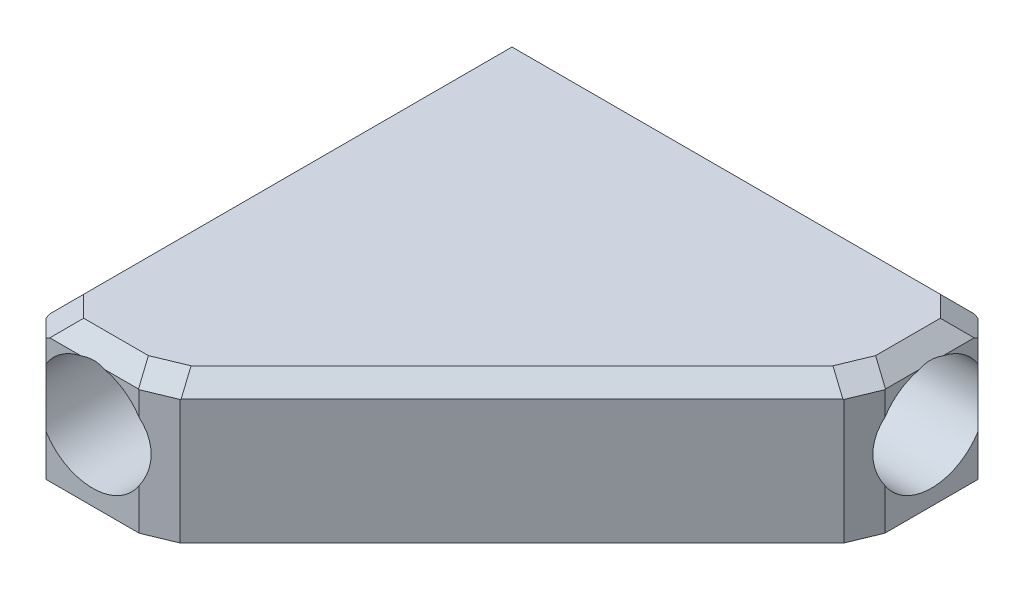
ISO-10303-21;
HEADER;
FILE_DESCRIPTION(('STEP AP214'),'2;1');
FILE_NAME('part.step','',(''),(''),'','','');
FILE_SCHEMA(('AUTOMOTIVE_DESIGN { 1 0 10303 214 1 1 1 1 }'));
ENDSEC;
DATA;
#1=APPLICATION_CONTEXT('core data for automotive mechanical design processes');
#2=APPLICATION_PROTOCOL_DEFINITION('international standard','automotive_design',2000,#1);
#3=PRODUCT_CONTEXT('',#1,'mechanical');
#4=PRODUCT('Part','Part','',(#3));
#5=PRODUCT_RELATED_PRODUCT_CATEGORY('part','',(#4));
#6=PRODUCT_DEFINITION_FORMATION('','',#4);
#7=PRODUCT_DEFINITION_CONTEXT('part definition',#1,'design');
#8=PRODUCT_DEFINITION('design','',#6,#7);
#9=PRODUCT_DEFINITION_SHAPE('','',#8);
#10=(LENGTH_UNIT() NAMED_UNIT(*) SI_UNIT(.MILLI.,.METRE.));
#11=(NAMED_UNIT(*) PLANE_ANGLE_UNIT() SI_UNIT($,.RADIAN.));
#12=(NAMED_UNIT(*) SI_UNIT($,.STERADIAN.) SOLID_ANGLE_UNIT());
#13=UNCERTAINTY_MEASURE_WITH_UNIT(LENGTH_MEASURE(1.E-05),#10,'distance_accuracy_value','');
#14=(GEOMETRIC_REPRESENTATION_CONTEXT(3) GLOBAL_UNCERTAINTY_ASSIGNED_CONTEXT((#13)) GLOBAL_UNIT_ASSIGNED_CONTEXT((#10,
#11,#12)) REPRESENTATION_CONTEXT('',''));
#15=CARTESIAN_POINT('',(0.,0.,0.));
#16=DIRECTION('',(0.,0.,1.));
#17=DIRECTION('',(1.,0.,0.));
#18=AXIS2_PLACEMENT_3D('',#15,#16,#17);
#19=CARTESIAN_POINT('',(49.5,0.,0.));
#20=DIRECTION('',(1.,0.,0.));
#21=DIRECTION('',(0.,0.,-1.));
#22=AXIS2_PLACEMENT_3D('',#19,#20,#21);
#23=PLANE('',#22);
#24=DIRECTION('',(0.,0.,-1.));
#25=VECTOR('',#24,1.);
#26=CARTESIAN_POINT('',(49.5,0.,-5.));
#27=LINE('',#26,#25);
#28=CARTESIAN_POINT('',(49.5,0.,-7.00000000000002));
#29=VERTEX_POINT('',#28);
#30=CARTESIAN_POINT('',(49.5,0.,-18.));
#31=VERTEX_POINT('',#30);
#32=EDGE_CURVE('E251',#29,#31,#27,.T.);
#33=ORIENTED_EDGE('',*,*,#32,.T.);
#34=DIRECTION('',(0.,1.,0.));
#35=VECTOR('',#34,1.);
#36=CARTESIAN_POINT('',(49.5,0.,-18.));
#37=LINE('',#36,#35);
#38=CARTESIAN_POINT('',(49.5,4.88589838486222,-18.));
#39=VERTEX_POINT('',#38);
#40=EDGE_CURVE('E253',#31,#39,#37,.T.);
#41=ORIENTED_EDGE('',*,*,#40,.T.);
#42=CARTESIAN_POINT('',(49.5,8.35,-12.5));
#43=DIRECTION('',(1.,0.,0.));
#44=DIRECTION('',(0.,0.,-1.));
#45=AXIS2_PLACEMENT_3D('',#42,#43,#44);
#46=CIRCLE('',#45,6.5);
#47=CARTESIAN_POINT('',(49.5,4.88589838486221,-7.00000000000002));
#48=VERTEX_POINT('',#47);
#49=EDGE_CURVE('E449',#48,#39,#46,.T.);
#50=ORIENTED_EDGE('',*,*,#49,.F.);
#51=DIRECTION('',(0.,-1.,0.));
#52=VECTOR('',#51,1.);
#53=CARTESIAN_POINT('',(49.5,0.,-7.00000000000002));
#54=LINE('',#53,#52);
#55=EDGE_CURVE('E256',#48,#29,#54,.T.);
#56=ORIENTED_EDGE('',*,*,#55,.T.);
#57=EDGE_LOOP('',(#33,#41,#50,#56));
#58=FACE_BOUND('',#57,.T.);
#59=ADVANCED_FACE('F53',(#58),#23,.T.);
#60=DIRECTION('',(0.,0.333333333333337,-0.942809041582062));
#61=VECTOR('',#60,1.);
#62=CARTESIAN_POINT('',(49.5,10.8403734826041,3.83265080007213));
#63=LINE('',#62,#61);
#64=CARTESIAN_POINT('',(49.5,14.7,-7.08402153311996));
#65=VERTEX_POINT('',#64);
#66=CARTESIAN_POINT('',(49.5,14.6702939020826,-7.00000000000002));
#67=VERTEX_POINT('',#66);
#68=EDGE_CURVE('E438',#65,#67,#63,.F.);
#69=ORIENTED_EDGE('',*,*,#68,.T.);
#70=DIRECTION('',(0.,-1.,0.));
#71=VECTOR('',#70,1.);
#72=CARTESIAN_POINT('',(49.5,0.,-7.00000000000002));
#73=LINE('',#72,#71);
#74=CARTESIAN_POINT('',(49.5,11.8141016151378,-7.00000000000002));
#75=VERTEX_POINT('',#74);
#76=EDGE_CURVE('E277',#67,#75,#73,.T.);
#77=ORIENTED_EDGE('',*,*,#76,.T.);
#78=CARTESIAN_POINT('',(49.5,14.7,-11.1116556623084));
#79=VERTEX_POINT('',#78);
#80=EDGE_CURVE('E260',#79,#75,#46,.T.);
#81=ORIENTED_EDGE('',*,*,#80,.F.);
#82=DIRECTION('',(0.,0.,1.));
#83=VECTOR('',#82,1.);
#84=CARTESIAN_POINT('',(49.5,14.7,0.));
#85=LINE('',#84,#83);
#86=EDGE_CURVE('E345',#79,#65,#85,.T.);
#87=ORIENTED_EDGE('',*,*,#86,.T.);
#88=EDGE_LOOP('',(#69,#77,#81,#87));
#89=FACE_BOUND('',#88,.T.);
#90=ADVANCED_FACE('F443',(#89),#23,.T.);
#91=CARTESIAN_POINT('',(0.,0.,37.));
#92=DIRECTION('',(0.,0.,1.));
#93=DIRECTION('',(1.,0.,0.));
#94=AXIS2_PLACEMENT_3D('',#91,#92,#93);
#95=PLANE('',#94);
#96=DIRECTION('',(1.,0.,0.));
#97=VECTOR('',#96,1.);
#98=CARTESIAN_POINT('',(-5.5,0.,37.));
#99=LINE('',#98,#97);
#100=CARTESIAN_POINT('',(-5.5,0.,37.));
#101=VERTEX_POINT('',#100);
#102=CARTESIAN_POINT('',(5.49999999999999,0.,37.));
#103=VERTEX_POINT('',#102);
#104=EDGE_CURVE('E350',#101,#103,#99,.T.);
#105=ORIENTED_EDGE('',*,*,#104,.T.);
#106=DIRECTION('',(0.,1.,0.));
#107=VECTOR('',#106,1.);
#108=CARTESIAN_POINT('',(5.49999999999999,0.,37.));
#109=LINE('',#108,#107);
#110=CARTESIAN_POINT('',(5.49999999999999,4.88589838486222,37.));
#111=VERTEX_POINT('',#110);
#112=EDGE_CURVE('E400',#103,#111,#109,.T.);
#113=ORIENTED_EDGE('',*,*,#112,.T.);
#114=CARTESIAN_POINT('',(0.,8.35,37.));
#115=DIRECTION('',(0.,0.,1.));
#116=DIRECTION('',(1.,0.,0.));
#117=AXIS2_PLACEMENT_3D('',#114,#115,#116);
#118=CIRCLE('',#117,6.5);
#119=CARTESIAN_POINT('',(-5.49999999999999,4.88589838486222,37.));
#120=VERTEX_POINT('',#119);
#121=EDGE_CURVE('E469',#120,#111,#118,.T.);
#122=ORIENTED_EDGE('',*,*,#121,.F.);
#123=DIRECTION('',(0.,-1.,0.));
#124=VECTOR('',#123,1.);
#125=CARTESIAN_POINT('',(-5.49999999999999,0.,37.));
#126=LINE('',#125,#124);
#127=EDGE_CURVE('E394',#120,#101,#126,.T.);
#128=ORIENTED_EDGE('',*,*,#127,.T.);
#129=EDGE_LOOP('',(#105,#113,#122,#128));
#130=FACE_BOUND('',#129,.T.);
#131=ADVANCED_FACE('F468',(#130),#95,.T.);
#132=CARTESIAN_POINT('',(5.49999999999999,11.8141016151378,37.));
#133=VERTEX_POINT('',#132);
#134=CARTESIAN_POINT('',(1.38834433769165,14.7,37.));
#135=VERTEX_POINT('',#134);
#136=EDGE_CURVE('E259',#133,#135,#118,.T.);
#137=ORIENTED_EDGE('',*,*,#136,.F.);
#138=DIRECTION('',(0.,1.,0.));
#139=VECTOR('',#138,1.);
#140=CARTESIAN_POINT('',(5.49999999999999,0.,37.));
#141=LINE('',#140,#139);
#142=CARTESIAN_POINT('',(5.49999999999999,14.6702939020826,37.));
#143=VERTEX_POINT('',#142);
#144=EDGE_CURVE('E398',#133,#143,#141,.T.);
#145=ORIENTED_EDGE('',*,*,#144,.T.);
#146=DIRECTION('',(0.942809041582063,-0.333333333333335,0.));
#147=VECTOR('',#146,1.);
#148=CARTESIAN_POINT('',(5.22153968896102,14.768744489196,37.));
#149=LINE('',#148,#147);
#150=CARTESIAN_POINT('',(5.41597846688002,14.7,37.));
#151=VERTEX_POINT('',#150);
#152=EDGE_CURVE('E396',#143,#151,#149,.F.);
#153=ORIENTED_EDGE('',*,*,#152,.T.);
#154=DIRECTION('',(-1.,0.,0.));
#155=VECTOR('',#154,1.);
#156=CARTESIAN_POINT('',(0.,14.7,37.));
#157=LINE('',#156,#155);
#158=EDGE_CURVE('E387',#151,#135,#157,.T.);
#159=ORIENTED_EDGE('',*,*,#158,.T.);
#160=EDGE_LOOP('',(#137,#145,#153,#159));
#161=FACE_BOUND('',#160,.T.);
#162=ADVANCED_FACE('F589',(#161),#95,.T.);
#163=CARTESIAN_POINT('',(0.,0.,0.));
#164=DIRECTION('',(0.,1.,0.));
#165=DIRECTION('',(0.,0.,1.));
#166=AXIS2_PLACEMENT_3D('',#163,#164,#165);
#167=PLANE('',#166);
#168=DIRECTION('',(-0.707106781186547,0.,0.707106781186548));
#169=VECTOR('',#168,1.);
#170=CARTESIAN_POINT('',(7.5,0.,37.));
#171=LINE('',#170,#169);
#172=CARTESIAN_POINT('',(48.0857864376269,0.,-3.58578643762689));
#173=VERTEX_POINT('',#172);
#174=CARTESIAN_POINT('',(8.91421356237311,0.,35.5857864376269));
#175=VERTEX_POINT('',#174);
#176=EDGE_CURVE('E296',#173,#175,#171,.T.);
#177=ORIENTED_EDGE('',*,*,#176,.T.);
#178=DIRECTION('',(0.923879532511287,0.,-0.38268343236509));
#179=VECTOR('',#178,1.);
#180=CARTESIAN_POINT('',(5.49999999999999,0.,37.));
#181=LINE('',#180,#179);
#182=EDGE_CURVE('E417',#175,#103,#181,.F.);
#183=ORIENTED_EDGE('',*,*,#182,.T.);
#184=ORIENTED_EDGE('',*,*,#104,.F.);
#185=DIRECTION('',(0.,0.,-1.));
#186=VECTOR('',#185,1.);
#187=CARTESIAN_POINT('',(-5.49999999999999,0.,-20.));
#188=LINE('',#187,#186);
#189=CARTESIAN_POINT('',(-5.49999999999999,0.,-9.03589838486224));
#190=VERTEX_POINT('',#189);
#191=EDGE_CURVE('E491',#101,#190,#188,.T.);
#192=ORIENTED_EDGE('',*,*,#191,.T.);
#193=CARTESIAN_POINT('',(0.,0.,-12.5));
#194=DIRECTION('',(0.,-1.,0.));
#195=DIRECTION('',(0.,0.,-1.));
#196=AXIS2_PLACEMENT_3D('',#193,#194,#195);
#197=CIRCLE('',#196,6.5);
#198=CARTESIAN_POINT('',(3.46410161513776,0.,-18.));
#199=VERTEX_POINT('',#198);
#200=EDGE_CURVE('E267',#199,#190,#197,.T.);
#201=ORIENTED_EDGE('',*,*,#200,.F.);
#202=DIRECTION('',(1.,0.,0.));
#203=VECTOR('',#202,1.);
#204=CARTESIAN_POINT('',(17.5,0.,-18.));
#205=LINE('',#204,#203);
#206=EDGE_CURVE('E239',#199,#31,#205,.T.);
#207=ORIENTED_EDGE('',*,*,#206,.T.);
#208=ORIENTED_EDGE('',*,*,#32,.F.);
#209=DIRECTION('',(0.382683432365089,0.,-0.923879532511287));
#210=VECTOR('',#209,1.);
#211=CARTESIAN_POINT('',(49.5,0.,-7.00000000000002));
#212=LINE('',#211,#210);
#213=EDGE_CURVE('E415',#29,#173,#212,.F.);
#214=ORIENTED_EDGE('',*,*,#213,.T.);
#215=EDGE_LOOP('',(#177,#183,#184,#192,#201,#207,#208,#214));
#216=FACE_BOUND('',#215,.T.);
#217=ADVANCED_FACE('F264',(#216),#167,.F.);
#218=CARTESIAN_POINT('',(-7.5,16.7,0.));
#219=DIRECTION('',(-1.,0.,0.));
#220=DIRECTION('',(0.,0.,1.));
#221=AXIS2_PLACEMENT_3D('',#218,#219,#220);
#222=PLANE('',#221);
#223=DIRECTION('',(0.,0.,1.));
#224=VECTOR('',#223,1.);
#225=CARTESIAN_POINT('',(-7.5,2.,5.));
#226=LINE('',#225,#224);
#227=CARTESIAN_POINT('',(-7.49999999999999,2.,-18.));
#228=VERTEX_POINT('',#227);
#229=CARTESIAN_POINT('',(-7.5,2.,35.));
#230=VERTEX_POINT('',#229);
#231=EDGE_CURVE('E337',#228,#230,#226,.T.);
#232=ORIENTED_EDGE('',*,*,#231,.T.);
#233=DIRECTION('',(0.,1.,0.));
#234=VECTOR('',#233,1.);
#235=CARTESIAN_POINT('',(-7.5,16.7,35.));
#236=LINE('',#235,#234);
#237=CARTESIAN_POINT('',(-7.5,14.4752551286084,35.));
#238=VERTEX_POINT('',#237);
#239=EDGE_CURVE('E71',#230,#238,#236,.T.);
#240=ORIENTED_EDGE('',*,*,#239,.T.);
#241=DIRECTION('',(0.,-0.447213595499961,0.894427190999915));
#242=VECTOR('',#241,1.);
#243=CARTESIAN_POINT('',(-7.5,28.9202041028868,6.11010205144343));
#244=LINE('',#243,#242);
#245=CARTESIAN_POINT('',(-7.5,14.7,34.5505102572168));
#246=VERTEX_POINT('',#245);
#247=EDGE_CURVE('E75',#238,#246,#244,.F.);
#248=ORIENTED_EDGE('',*,*,#247,.T.);
#249=DIRECTION('',(0.,0.,-1.));
#250=VECTOR('',#249,1.);
#251=CARTESIAN_POINT('',(-7.5,14.7,0.));
#252=LINE('',#251,#250);
#253=CARTESIAN_POINT('',(-7.49999999999999,14.7,-18.));
#254=VERTEX_POINT('',#253);
#255=EDGE_CURVE('E327',#246,#254,#252,.T.);
#256=ORIENTED_EDGE('',*,*,#255,.T.);
#257=DIRECTION('',(0.,-1.,0.));
#258=VECTOR('',#257,1.);
#259=CARTESIAN_POINT('',(-7.49999999999999,16.7,-18.));
#260=LINE('',#259,#258);
#261=EDGE_CURVE('E497',#254,#228,#260,.T.);
#262=ORIENTED_EDGE('',*,*,#261,.T.);
#263=EDGE_LOOP('',(#232,#240,#248,#256,#262));
#264=FACE_BOUND('',#263,.T.);
#265=ADVANCED_FACE('F500',(#264),#222,.T.);
#266=CARTESIAN_POINT('',(0.,16.7,-20.));
#267=DIRECTION('',(0.,0.,-1.));
#268=DIRECTION('',(-1.,0.,0.));
#269=AXIS2_PLACEMENT_3D('',#266,#267,#268);
#270=PLANE('',#269);
#271=DIRECTION('',(-0.894427190999915,0.44721359549996,0.));
#272=VECTOR('',#271,1.);
#273=CARTESIAN_POINT('',(8.61010205144342,33.9202041028868,-20.));
#274=LINE('',#273,#272);
#275=CARTESIAN_POINT('',(47.0505102572168,14.7,-20.));
#276=VERTEX_POINT('',#275);
#277=CARTESIAN_POINT('',(47.5,14.4752551286084,-20.));
#278=VERTEX_POINT('',#277);
#279=EDGE_CURVE('E282',#276,#278,#274,.F.);
#280=ORIENTED_EDGE('',*,*,#279,.T.);
#281=DIRECTION('',(0.,-1.,0.));
#282=VECTOR('',#281,1.);
#283=CARTESIAN_POINT('',(47.5,16.7,-20.));
#284=LINE('',#283,#282);
#285=CARTESIAN_POINT('',(47.5,2.,-20.));
#286=VERTEX_POINT('',#285);
#287=EDGE_CURVE('E246',#278,#286,#284,.T.);
#288=ORIENTED_EDGE('',*,*,#287,.T.);
#289=DIRECTION('',(-1.,0.,0.));
#290=VECTOR('',#289,1.);
#291=CARTESIAN_POINT('',(-7.5,2.,-20.));
#292=LINE('',#291,#290);
#293=CARTESIAN_POINT('',(-5.49999999999999,2.,-20.));
#294=VERTEX_POINT('',#293);
#295=EDGE_CURVE('E241',#286,#294,#292,.T.);
#296=ORIENTED_EDGE('',*,*,#295,.T.);
#297=DIRECTION('',(0.,1.,0.));
#298=VECTOR('',#297,1.);
#299=CARTESIAN_POINT('',(-5.49999999999999,16.7,-20.));
#300=LINE('',#299,#298);
#301=CARTESIAN_POINT('',(-5.49999999999999,14.7,-20.));
#302=VERTEX_POINT('',#301);
#303=EDGE_CURVE('E334',#294,#302,#300,.T.);
#304=ORIENTED_EDGE('',*,*,#303,.T.);
#305=DIRECTION('',(1.,0.,0.));
#306=VECTOR('',#305,1.);
#307=CARTESIAN_POINT('',(0.,14.7,-20.));
#308=LINE('',#307,#306);
#309=EDGE_CURVE('E342',#302,#276,#308,.T.);
#310=ORIENTED_EDGE('',*,*,#309,.T.);
#311=EDGE_LOOP('',(#280,#288,#296,#304,#310));
#312=FACE_BOUND('',#311,.T.);
#313=ADVANCED_FACE('F566',(#312),#270,.T.);
#314=CARTESIAN_POINT('',(0.,16.7,0.));
#315=DIRECTION('',(0.,1.,0.));
#316=DIRECTION('',(0.,0.,1.));
#317=AXIS2_PLACEMENT_3D('',#314,#315,#316);
#318=PLANE('',#317);
#319=DIRECTION('',(1.,0.,0.));
#320=VECTOR('',#319,1.);
#321=CARTESIAN_POINT('',(0.,16.7,35.));
#322=LINE('',#321,#320);
#323=CARTESIAN_POINT('',(-3.05051025721677,16.7,35.));
#324=VERTEX_POINT('',#323);
#325=CARTESIAN_POINT('',(4.58755134213382,16.7,35.));
#326=VERTEX_POINT('',#325);
#327=EDGE_CURVE('E373',#324,#326,#322,.T.);
#328=ORIENTED_EDGE('',*,*,#327,.T.);
#329=DIRECTION('',(-0.923879532511287,0.,0.382683432365088));
#330=VECTOR('',#329,1.);
#331=CARTESIAN_POINT('',(13.0462000102993,16.7,31.4963130022967));
#332=LINE('',#331,#330);
#333=CARTESIAN_POINT('',(8.14519863346173,16.7,33.5263742417921));
#334=VERTEX_POINT('',#333);
#335=EDGE_CURVE('E432',#326,#334,#332,.F.);
#336=ORIENTED_EDGE('',*,*,#335,.T.);
#337=DIRECTION('',(0.707106781186547,0.,-0.707106781186548));
#338=VECTOR('',#337,1.);
#339=CARTESIAN_POINT('',(20.8357864376269,16.7,20.8357864376269));
#340=LINE('',#339,#338);
#341=CARTESIAN_POINT('',(46.0263742417921,16.7,-4.35480136653825));
#342=VERTEX_POINT('',#341);
#343=EDGE_CURVE('E375',#334,#342,#340,.T.);
#344=ORIENTED_EDGE('',*,*,#343,.T.);
#345=DIRECTION('',(-0.382683432365091,0.,0.923879532511286));
#346=VECTOR('',#345,1.);
#347=CARTESIAN_POINT('',(37.7463130022967,16.7,15.6350347751312));
#348=LINE('',#347,#346);
#349=CARTESIAN_POINT('',(47.5,16.7,-7.91244865786616));
#350=VERTEX_POINT('',#349);
#351=EDGE_CURVE('E430',#342,#350,#348,.F.);
#352=ORIENTED_EDGE('',*,*,#351,.T.);
#353=DIRECTION('',(0.,0.,-1.));
#354=VECTOR('',#353,1.);
#355=CARTESIAN_POINT('',(47.5,16.7,0.));
#356=LINE('',#355,#354);
#357=CARTESIAN_POINT('',(47.5,16.7,-15.5505102572168));
#358=VERTEX_POINT('',#357);
#359=EDGE_CURVE('E378',#350,#358,#356,.T.);
#360=ORIENTED_EDGE('',*,*,#359,.T.);
#361=DIRECTION('',(0.707106781186548,0.,0.707106781186547));
#362=VECTOR('',#361,1.);
#363=CARTESIAN_POINT('',(31.5252551286084,16.7,-31.5252551286084));
#364=LINE('',#363,#362);
#365=CARTESIAN_POINT('',(45.0505102572168,16.7,-18.));
#366=VERTEX_POINT('',#365);
#367=EDGE_CURVE('E428',#358,#366,#364,.F.);
#368=ORIENTED_EDGE('',*,*,#367,.T.);
#369=DIRECTION('',(-1.,0.,0.));
#370=VECTOR('',#369,1.);
#371=CARTESIAN_POINT('',(0.,16.7,-18.));
#372=LINE('',#371,#370);
#373=CARTESIAN_POINT('',(-5.49999999999999,16.7,-18.));
#374=VERTEX_POINT('',#373);
#375=EDGE_CURVE('E333',#366,#374,#372,.T.);
#376=ORIENTED_EDGE('',*,*,#375,.T.);
#377=DIRECTION('',(0.,0.,1.));
#378=VECTOR('',#377,1.);
#379=CARTESIAN_POINT('',(-5.49999999999999,16.7,0.));
#380=LINE('',#379,#378);
#381=CARTESIAN_POINT('',(-5.5,16.7,32.5505102572168));
#382=VERTEX_POINT('',#381);
#383=EDGE_CURVE('E325',#374,#382,#380,.T.);
#384=ORIENTED_EDGE('',*,*,#383,.T.);
#385=DIRECTION('',(-0.707106781186549,0.,-0.707106781186545));
#386=VECTOR('',#385,1.);
#387=CARTESIAN_POINT('',(-19.0252551286084,16.7,19.0252551286085));
#388=LINE('',#387,#386);
#389=EDGE_CURVE('E319',#382,#324,#388,.F.);
#390=ORIENTED_EDGE('',*,*,#389,.T.);
#391=EDGE_LOOP('',(#328,#336,#344,#352,#360,#368,#376,#384,#390));
#392=FACE_BOUND('',#391,.T.);
#393=ADVANCED_FACE('F330',(#392),#318,.T.);
#394=CARTESIAN_POINT('',(-5.49999999999999,0.,-15.9641016151378));
#395=VERTEX_POINT('',#394);
#396=CARTESIAN_POINT('',(-3.46410161513776,0.,-18.));
#397=VERTEX_POINT('',#396);
#398=EDGE_CURVE('E365',#395,#397,#197,.T.);
#399=ORIENTED_EDGE('',*,*,#398,.F.);
#400=DIRECTION('',(0.,0.,-1.));
#401=VECTOR('',#400,1.);
#402=CARTESIAN_POINT('',(-5.49999999999999,0.,-20.));
#403=LINE('',#402,#401);
#404=CARTESIAN_POINT('',(-5.49999999999999,0.,-18.));
#405=VERTEX_POINT('',#404);
#406=EDGE_CURVE('E489',#395,#405,#403,.T.);
#407=ORIENTED_EDGE('',*,*,#406,.T.);
#408=DIRECTION('',(1.,0.,0.));
#409=VECTOR('',#408,1.);
#410=CARTESIAN_POINT('',(17.5,0.,-18.));
#411=LINE('',#410,#409);
#412=EDGE_CURVE('E268',#405,#397,#411,.T.);
#413=ORIENTED_EDGE('',*,*,#412,.T.);
#414=EDGE_LOOP('',(#399,#407,#413));
#415=FACE_BOUND('',#414,.T.);
#416=ADVANCED_FACE('F514',(#415),#167,.F.);
#417=CARTESIAN_POINT('',(0.,14.7,0.));
#418=DIRECTION('',(0.,1.,0.));
#419=DIRECTION('',(0.,0.,1.));
#420=AXIS2_PLACEMENT_3D('',#417,#418,#419);
#421=PLANE('',#420);
#422=CARTESIAN_POINT('',(0.,14.7,-12.5));
#423=DIRECTION('',(0.,1.,0.));
#424=DIRECTION('',(0.,0.,1.));
#425=AXIS2_PLACEMENT_3D('',#422,#423,#424);
#426=CIRCLE('',#425,6.5);
#427=CARTESIAN_POINT('',(0.,14.7,-6.00000000000001));
#428=VERTEX_POINT('',#427);
#429=EDGE_CURVE('E480',#428,#428,#426,.F.);
#430=ORIENTED_EDGE('',*,*,#429,.T.);
#431=EDGE_LOOP('',(#430));
#432=FACE_BOUND('',#431,.T.);
#433=ADVANCED_FACE('F890',(#432),#421,.F.);
#434=CARTESIAN_POINT('',(0.,35.0847763108502,-12.5));
#435=DIRECTION('',(0.,-1.,0.));
#436=DIRECTION('',(0.,0.,-1.));
#437=AXIS2_PLACEMENT_3D('',#434,#435,#436);
#438=CYLINDRICAL_SURFACE('',#437,6.5);
#439=ORIENTED_EDGE('',*,*,#200,.T.);
#440=CARTESIAN_POINT('',(0.,-5.49999999999999,-12.5));
#441=DIRECTION('',(-0.707106781186547,-0.707106781186548,0.));
#442=DIRECTION('',(0.707106781186548,-0.707106781186547,0.));
#443=AXIS2_PLACEMENT_3D('',#440,#441,#442);
#444=ELLIPSE('',#443,9.19238815542512,6.5);
#445=EDGE_CURVE('E495',#190,#395,#444,.T.);
#446=ORIENTED_EDGE('',*,*,#445,.T.);
#447=ORIENTED_EDGE('',*,*,#398,.T.);
#448=CARTESIAN_POINT('',(0.,-5.5,-12.5));
#449=DIRECTION('',(0.,-0.707106781186547,-0.707106781186548));
#450=DIRECTION('',(0.,-0.707106781186548,0.707106781186547));
#451=AXIS2_PLACEMENT_3D('',#448,#449,#450);
#452=ELLIPSE('',#451,9.19238815542512,6.5);
#453=EDGE_CURVE('E493',#397,#199,#452,.T.);
#454=ORIENTED_EDGE('',*,*,#453,.T.);
#455=EDGE_LOOP('',(#439,#446,#447,#454));
#456=FACE_BOUND('',#455,.T.);
#457=ORIENTED_EDGE('',*,*,#429,.F.);
#458=EDGE_LOOP('',(#457));
#459=FACE_BOUND('',#458,.T.);
#460=ADVANCED_FACE('F516',(#456,#459),#438,.F.);
#461=CARTESIAN_POINT('',(0.,14.7,-20.));
#462=DIRECTION('',(0.,-0.707106781186547,0.707106781186548));
#463=DIRECTION('',(1.,0.,0.));
#464=AXIS2_PLACEMENT_3D('',#461,#462,#463);
#465=PLANE('',#464);
#466=ORIENTED_EDGE('',*,*,#375,.F.);
#467=DIRECTION('',(-0.577350269189622,0.577350269189628,0.577350269189627));
#468=VECTOR('',#467,1.);
#469=CARTESIAN_POINT('',(31.3670068381447,30.3835034190722,-4.3164965809278));
#470=LINE('',#469,#468);
#471=EDGE_CURVE('E63',#366,#276,#470,.F.);
#472=ORIENTED_EDGE('',*,*,#471,.T.);
#473=ORIENTED_EDGE('',*,*,#309,.F.);
#474=DIRECTION('',(0.,0.707106781186548,0.707106781186547));
#475=VECTOR('',#474,1.);
#476=CARTESIAN_POINT('',(-5.49999999999999,15.7,-19.));
#477=LINE('',#476,#475);
#478=EDGE_CURVE('E362',#374,#302,#477,.F.);
#479=ORIENTED_EDGE('',*,*,#478,.F.);
#480=EDGE_LOOP('',(#466,#472,#473,#479));
#481=FACE_BOUND('',#480,.T.);
#482=ADVANCED_FACE('F557',(#481),#465,.F.);
#483=CARTESIAN_POINT('',(-7.5,14.7,0.));
#484=DIRECTION('',(0.707106781186547,-0.707106781186548,0.));
#485=DIRECTION('',(0.,0.,-1.));
#486=AXIS2_PLACEMENT_3D('',#483,#484,#485);
#487=PLANE('',#486);
#488=ORIENTED_EDGE('',*,*,#255,.F.);
#489=DIRECTION('',(-0.577350269189628,-0.577350269189628,0.577350269189622));
#490=VECTOR('',#489,1.);
#491=CARTESIAN_POINT('',(4.01683675240555,26.2168367524055,23.0336735048113));
#492=LINE('',#491,#490);
#493=EDGE_CURVE('E14',#246,#382,#492,.F.);
#494=ORIENTED_EDGE('',*,*,#493,.T.);
#495=ORIENTED_EDGE('',*,*,#383,.F.);
#496=DIRECTION('',(-0.707106781186548,-0.707106781186547,0.));
#497=VECTOR('',#496,1.);
#498=CARTESIAN_POINT('',(-7.49999999999999,14.7,-18.));
#499=LINE('',#498,#497);
#500=EDGE_CURVE('E359',#254,#374,#499,.F.);
#501=ORIENTED_EDGE('',*,*,#500,.F.);
#502=EDGE_LOOP('',(#488,#494,#495,#501));
#503=FACE_BOUND('',#502,.T.);
#504=ADVANCED_FACE('F323',(#503),#487,.F.);
#505=CARTESIAN_POINT('',(-7.49999999999999,14.7,-18.));
#506=DIRECTION('',(-0.577350269189626,0.577350269189626,-0.577350269189626));
#507=DIRECTION('',(0.,0.707106781186548,0.707106781186547));
#508=AXIS2_PLACEMENT_3D('',#505,#506,#507);
#509=PLANE('',#508);
#510=ORIENTED_EDGE('',*,*,#500,.T.);
#511=ORIENTED_EDGE('',*,*,#478,.T.);
#512=DIRECTION('',(0.707106781186548,0.,-0.707106781186547));
#513=VECTOR('',#512,1.);
#514=CARTESIAN_POINT('',(-7.49999999999999,14.7,-18.));
#515=LINE('',#514,#513);
#516=EDGE_CURVE('E356',#254,#302,#515,.T.);
#517=ORIENTED_EDGE('',*,*,#516,.F.);
#518=EDGE_LOOP('',(#510,#511,#517));
#519=FACE_BOUND('',#518,.T.);
#520=ADVANCED_FACE('F561',(#519),#509,.T.);
#521=CARTESIAN_POINT('',(0.,0.,-18.));
#522=DIRECTION('',(0.,-0.707106781186547,-0.707106781186548));
#523=DIRECTION('',(-1.,0.,0.));
#524=AXIS2_PLACEMENT_3D('',#521,#522,#523);
#525=PLANE('',#524);
#526=ORIENTED_EDGE('',*,*,#295,.F.);
#527=DIRECTION('',(-0.577350269189626,0.577350269189626,-0.577350269189625));
#528=VECTOR('',#527,1.);
#529=CARTESIAN_POINT('',(33.,16.5,-34.5));
#530=LINE('',#529,#528);
#531=EDGE_CURVE('E234',#286,#31,#530,.F.);
#532=ORIENTED_EDGE('',*,*,#531,.T.);
#533=ORIENTED_EDGE('',*,*,#206,.F.);
#534=ORIENTED_EDGE('',*,*,#453,.F.);
#535=ORIENTED_EDGE('',*,*,#412,.F.);
#536=DIRECTION('',(0.,-0.707106781186548,0.707106781186547));
#537=VECTOR('',#536,1.);
#538=CARTESIAN_POINT('',(-5.49999999999999,0.,-18.));
#539=LINE('',#538,#537);
#540=EDGE_CURVE('E353',#294,#405,#539,.T.);
#541=ORIENTED_EDGE('',*,*,#540,.F.);
#542=EDGE_LOOP('',(#526,#532,#533,#534,#535,#541));
#543=FACE_BOUND('',#542,.T.);
#544=ADVANCED_FACE('F236',(#543),#525,.T.);
#545=CARTESIAN_POINT('',(-7.49999999999999,16.7,-18.));
#546=DIRECTION('',(0.707106781186547,0.,0.707106781186548));
#547=DIRECTION('',(0.,-1.,0.));
#548=AXIS2_PLACEMENT_3D('',#545,#546,#547);
#549=PLANE('',#548);
#550=ORIENTED_EDGE('',*,*,#516,.T.);
#551=ORIENTED_EDGE('',*,*,#303,.F.);
#552=DIRECTION('',(-0.707106781186548,0.,0.707106781186547));
#553=VECTOR('',#552,1.);
#554=CARTESIAN_POINT('',(-6.49999999999999,2.,-19.));
#555=LINE('',#554,#553);
#556=EDGE_CURVE('E349',#228,#294,#555,.F.);
#557=ORIENTED_EDGE('',*,*,#556,.F.);
#558=ORIENTED_EDGE('',*,*,#261,.F.);
#559=EDGE_LOOP('',(#550,#551,#557,#558));
#560=FACE_BOUND('',#559,.T.);
#561=ADVANCED_FACE('F564',(#560),#549,.F.);
#562=CARTESIAN_POINT('',(-5.49999999999999,0.,-18.));
#563=DIRECTION('',(-0.577350269189626,-0.577350269189626,-0.577350269189626));
#564=DIRECTION('',(0.,0.707106781186548,-0.707106781186547));
#565=AXIS2_PLACEMENT_3D('',#562,#563,#564);
#566=PLANE('',#565);
#567=ORIENTED_EDGE('',*,*,#556,.T.);
#568=ORIENTED_EDGE('',*,*,#540,.T.);
#569=DIRECTION('',(-0.707106781186548,0.707106781186547,0.));
#570=VECTOR('',#569,1.);
#571=CARTESIAN_POINT('',(-5.49999999999999,0.,-18.));
#572=LINE('',#571,#570);
#573=EDGE_CURVE('E346',#228,#405,#572,.F.);
#574=ORIENTED_EDGE('',*,*,#573,.F.);
#575=EDGE_LOOP('',(#567,#568,#574));
#576=FACE_BOUND('',#575,.T.);
#577=ADVANCED_FACE('F509',(#576),#566,.T.);
#578=CARTESIAN_POINT('',(-5.49999999999999,0.,0.));
#579=DIRECTION('',(-0.707106781186547,-0.707106781186548,0.));
#580=DIRECTION('',(0.,0.,1.));
#581=AXIS2_PLACEMENT_3D('',#578,#579,#580);
#582=PLANE('',#581);
#583=ORIENTED_EDGE('',*,*,#191,.F.);
#584=DIRECTION('',(0.577350269189626,-0.577350269189625,0.577350269189627));
#585=VECTOR('',#584,1.);
#586=CARTESIAN_POINT('',(-17.8333333333333,12.3333333333333,24.6666666666666));
#587=LINE('',#586,#585);
#588=EDGE_CURVE('E245',#101,#230,#587,.F.);
#589=ORIENTED_EDGE('',*,*,#588,.T.);
#590=ORIENTED_EDGE('',*,*,#231,.F.);
#591=ORIENTED_EDGE('',*,*,#573,.T.);
#592=ORIENTED_EDGE('',*,*,#406,.F.);
#593=ORIENTED_EDGE('',*,*,#445,.F.);
#594=EDGE_LOOP('',(#583,#589,#590,#591,#592,#593));
#595=FACE_BOUND('',#594,.T.);
#596=ADVANCED_FACE('F506',(#595),#582,.T.);
#597=DIRECTION('',(0.894427190999915,0.447213595499959,0.));
#598=VECTOR('',#597,1.);
#599=CARTESIAN_POINT('',(-6.89010205144336,13.7802041028867,37.));
#600=LINE('',#599,#598);
#601=CARTESIAN_POINT('',(-5.05051025721681,14.7,37.));
#602=VERTEX_POINT('',#601);
#603=CARTESIAN_POINT('',(-5.49999999999999,14.4752551286084,37.));
#604=VERTEX_POINT('',#603);
#605=EDGE_CURVE('E317',#602,#604,#600,.F.);
#606=ORIENTED_EDGE('',*,*,#605,.T.);
#607=DIRECTION('',(0.,-1.,0.));
#608=VECTOR('',#607,1.);
#609=CARTESIAN_POINT('',(-5.49999999999999,0.,37.));
#610=LINE('',#609,#608);
#611=CARTESIAN_POINT('',(-5.49999999999998,11.8141016151378,37.));
#612=VERTEX_POINT('',#611);
#613=EDGE_CURVE('E312',#604,#612,#610,.T.);
#614=ORIENTED_EDGE('',*,*,#613,.T.);
#615=CARTESIAN_POINT('',(-1.38834433769164,14.7,37.));
#616=VERTEX_POINT('',#615);
#617=EDGE_CURVE('E475',#616,#612,#118,.T.);
#618=ORIENTED_EDGE('',*,*,#617,.F.);
#619=DIRECTION('',(-1.,0.,0.));
#620=VECTOR('',#619,1.);
#621=CARTESIAN_POINT('',(0.,14.7,37.));
#622=LINE('',#621,#620);
#623=EDGE_CURVE('E384',#616,#602,#622,.T.);
#624=ORIENTED_EDGE('',*,*,#623,.T.);
#625=EDGE_LOOP('',(#606,#614,#618,#624));
#626=FACE_BOUND('',#625,.T.);
#627=ADVANCED_FACE('F520',(#626),#95,.T.);
#628=CARTESIAN_POINT('',(0.,16.7,-3.3));
#629=DIRECTION('',(0.,0.,-1.));
#630=DIRECTION('',(-1.,0.,0.));
#631=AXIS2_PLACEMENT_3D('',#628,#629,#630);
#632=PLANE('',#631);
#633=CARTESIAN_POINT('',(0.,8.35,-3.3));
#634=DIRECTION('',(0.,0.,-1.));
#635=DIRECTION('',(-1.,0.,0.));
#636=AXIS2_PLACEMENT_3D('',#633,#634,#635);
#637=CIRCLE('',#636,6.5);
#638=CARTESIAN_POINT('',(-6.5,8.35,-3.3));
#639=VERTEX_POINT('',#638);
#640=EDGE_CURVE('E269',#639,#639,#637,.F.);
#641=ORIENTED_EDGE('',*,*,#640,.T.);
#642=EDGE_LOOP('',(#641));
#643=FACE_BOUND('',#642,.T.);
#644=ADVANCED_FACE('F579',(#643),#632,.F.);
#645=CARTESIAN_POINT('',(0.,8.35,-38.3847763108502));
#646=DIRECTION('',(0.,0.,1.));
#647=DIRECTION('',(1.,0.,0.));
#648=AXIS2_PLACEMENT_3D('',#645,#646,#647);
#649=CYLINDRICAL_SURFACE('',#648,6.5);
#650=ORIENTED_EDGE('',*,*,#640,.F.);
#651=EDGE_LOOP('',(#650));
#652=FACE_BOUND('',#651,.T.);
#653=ORIENTED_EDGE('',*,*,#121,.T.);
#654=CARTESIAN_POINT('',(0.,8.35,39.278174593052));
#655=DIRECTION('',(-0.38268343236509,0.,-0.923879532511287));
#656=DIRECTION('',(-0.923879532511287,0.,0.38268343236509));
#657=AXIS2_PLACEMENT_3D('',#654,#655,#656);
#658=ELLIPSE('',#657,7.03554930190056,6.5);
#659=EDGE_CURVE('E405',#111,#133,#658,.F.);
#660=ORIENTED_EDGE('',*,*,#659,.T.);
#661=ORIENTED_EDGE('',*,*,#136,.T.);
#662=CARTESIAN_POINT('',(0.,8.35,43.3499999999999));
#663=DIRECTION('',(0.,-0.707106781186544,-0.707106781186551));
#664=DIRECTION('',(0.,-0.707106781186551,0.707106781186544));
#665=AXIS2_PLACEMENT_3D('',#662,#663,#664);
#666=ELLIPSE('',#665,9.19238815542507,6.5);
#667=EDGE_CURVE('E390',#135,#616,#666,.F.);
#668=ORIENTED_EDGE('',*,*,#667,.T.);
#669=ORIENTED_EDGE('',*,*,#617,.T.);
#670=CARTESIAN_POINT('',(0.,8.35,42.5));
#671=DIRECTION('',(0.707106781186548,0.,-0.707106781186547));
#672=DIRECTION('',(0.707106781186547,0.,0.707106781186548));
#673=AXIS2_PLACEMENT_3D('',#670,#671,#672);
#674=ELLIPSE('',#673,9.19238815542513,6.5);
#675=EDGE_CURVE('E403',#612,#120,#674,.F.);
#676=ORIENTED_EDGE('',*,*,#675,.T.);
#677=EDGE_LOOP('',(#653,#660,#661,#668,#669,#676));
#678=FACE_BOUND('',#677,.T.);
#679=ADVANCED_FACE('F472',(#652,#678),#649,.F.);
#680=CARTESIAN_POINT('',(49.5,11.8141016151378,-18.));
#681=VERTEX_POINT('',#680);
#682=CARTESIAN_POINT('',(49.5,14.7,-13.8883443376917));
#683=VERTEX_POINT('',#682);
#684=EDGE_CURVE('E451',#681,#683,#46,.T.);
#685=ORIENTED_EDGE('',*,*,#684,.F.);
#686=DIRECTION('',(0.,1.,0.));
#687=VECTOR('',#686,1.);
#688=CARTESIAN_POINT('',(49.5,0.,-18.));
#689=LINE('',#688,#687);
#690=CARTESIAN_POINT('',(49.5,14.4752551286084,-18.));
#691=VERTEX_POINT('',#690);
#692=EDGE_CURVE('E436',#681,#691,#689,.T.);
#693=ORIENTED_EDGE('',*,*,#692,.T.);
#694=DIRECTION('',(0.,-0.44721359549996,-0.894427190999915));
#695=VECTOR('',#694,1.);
#696=CARTESIAN_POINT('',(49.5,18.7802041028867,-9.39010205144341));
#697=LINE('',#696,#695);
#698=CARTESIAN_POINT('',(49.5,14.7,-17.5505102572168));
#699=VERTEX_POINT('',#698);
#700=EDGE_CURVE('E434',#691,#699,#697,.F.);
#701=ORIENTED_EDGE('',*,*,#700,.T.);
#702=DIRECTION('',(0.,0.,1.));
#703=VECTOR('',#702,1.);
#704=CARTESIAN_POINT('',(49.5,14.7,0.));
#705=LINE('',#704,#703);
#706=EDGE_CURVE('E368',#699,#683,#705,.T.);
#707=ORIENTED_EDGE('',*,*,#706,.T.);
#708=EDGE_LOOP('',(#685,#693,#701,#707));
#709=FACE_BOUND('',#708,.T.);
#710=ADVANCED_FACE('F568',(#709),#23,.T.);
#711=CARTESIAN_POINT('',(9.2,16.7,0.));
#712=DIRECTION('',(-1.,0.,0.));
#713=DIRECTION('',(0.,0.,1.));
#714=AXIS2_PLACEMENT_3D('',#711,#712,#713);
#715=PLANE('',#714);
#716=CARTESIAN_POINT('',(9.2,8.35,-12.5));
#717=DIRECTION('',(-1.,0.,0.));
#718=DIRECTION('',(0.,0.,1.));
#719=AXIS2_PLACEMENT_3D('',#716,#717,#718);
#720=CIRCLE('',#719,6.5);
#721=CARTESIAN_POINT('',(9.2,8.35,-6.));
#722=VERTEX_POINT('',#721);
#723=EDGE_CURVE('E483',#722,#722,#720,.F.);
#724=ORIENTED_EDGE('',*,*,#723,.T.);
#725=EDGE_LOOP('',(#724));
#726=FACE_BOUND('',#725,.T.);
#727=ADVANCED_FACE('F570',(#726),#715,.F.);
#728=CARTESIAN_POINT('',(-25.8847763108502,8.35,-12.5));
#729=DIRECTION('',(1.,0.,0.));
#730=DIRECTION('',(0.,0.,-1.));
#731=AXIS2_PLACEMENT_3D('',#728,#729,#730);
#732=CYLINDRICAL_SURFACE('',#731,6.5);
#733=ORIENTED_EDGE('',*,*,#723,.F.);
#734=EDGE_LOOP('',(#733));
#735=FACE_BOUND('',#734,.T.);
#736=ORIENTED_EDGE('',*,*,#49,.T.);
#737=CARTESIAN_POINT('',(55.,8.35,-12.5));
#738=DIRECTION('',(-0.707106781186547,0.,0.707106781186548));
#739=DIRECTION('',(0.707106781186548,0.,0.707106781186547));
#740=AXIS2_PLACEMENT_3D('',#737,#738,#739);
#741=ELLIPSE('',#740,9.19238815542513,6.5);
#742=EDGE_CURVE('E273',#39,#681,#741,.F.);
#743=ORIENTED_EDGE('',*,*,#742,.T.);
#744=ORIENTED_EDGE('',*,*,#684,.T.);
#745=CARTESIAN_POINT('',(55.8499999999999,8.35,-12.5));
#746=DIRECTION('',(-0.707106781186551,-0.707106781186544,0.));
#747=DIRECTION('',(0.707106781186544,-0.707106781186551,0.));
#748=AXIS2_PLACEMENT_3D('',#745,#746,#747);
#749=ELLIPSE('',#748,9.19238815542507,6.5);
#750=EDGE_CURVE('E371',#683,#79,#749,.F.);
#751=ORIENTED_EDGE('',*,*,#750,.T.);
#752=ORIENTED_EDGE('',*,*,#80,.T.);
#753=CARTESIAN_POINT('',(51.778174593052,8.35,-12.5));
#754=DIRECTION('',(-0.923879532511287,0.,-0.382683432365089));
#755=DIRECTION('',(0.382683432365089,0.,-0.923879532511287));
#756=AXIS2_PLACEMENT_3D('',#753,#754,#755);
#757=ELLIPSE('',#756,7.03554930190056,6.5);
#758=EDGE_CURVE('E274',#75,#48,#757,.F.);
#759=ORIENTED_EDGE('',*,*,#758,.T.);
#760=EDGE_LOOP('',(#736,#743,#744,#751,#752,#759));
#761=FACE_BOUND('',#760,.T.);
#762=ADVANCED_FACE('F447',(#735,#761),#732,.F.);
#763=CARTESIAN_POINT('',(7.5,-59.39696961967,37.));
#764=DIRECTION('',(0.707106781186548,0.,0.707106781186547));
#765=DIRECTION('',(0.707106781186547,0.,-0.707106781186548));
#766=AXIS2_PLACEMENT_3D('',#763,#764,#765);
#767=PLANE('',#766);
#768=DIRECTION('',(0.666666666666665,0.333333333333337,-0.666666666666666));
#769=VECTOR('',#768,1.);
#770=CARTESIAN_POINT('',(-8.80225705345928,5.81205859416625,53.3022570534593));
#771=LINE('',#770,#769);
#772=CARTESIAN_POINT('',(8.97362575820793,14.7,35.5263742417921));
#773=VERTEX_POINT('',#772);
#774=CARTESIAN_POINT('',(8.91421356237311,14.6702939020826,35.5857864376269));
#775=VERTEX_POINT('',#774);
#776=EDGE_CURVE('E411',#773,#775,#771,.F.);
#777=ORIENTED_EDGE('',*,*,#776,.T.);
#778=DIRECTION('',(0.,-1.,0.));
#779=VECTOR('',#778,1.);
#780=CARTESIAN_POINT('',(8.91421356237311,-59.39696961967,35.5857864376269));
#781=LINE('',#780,#779);
#782=EDGE_CURVE('E413',#775,#175,#781,.T.);
#783=ORIENTED_EDGE('',*,*,#782,.T.);
#784=ORIENTED_EDGE('',*,*,#176,.F.);
#785=DIRECTION('',(0.,1.,0.));
#786=VECTOR('',#785,1.);
#787=CARTESIAN_POINT('',(48.0857864376269,-59.39696961967,-3.58578643762689));
#788=LINE('',#787,#786);
#789=CARTESIAN_POINT('',(48.0857864376269,14.6702939020826,-3.58578643762689));
#790=VERTEX_POINT('',#789);
#791=EDGE_CURVE('E409',#173,#790,#788,.T.);
#792=ORIENTED_EDGE('',*,*,#791,.T.);
#793=DIRECTION('',(0.666666666666666,-0.333333333333335,-0.666666666666666));
#794=VECTOR('',#793,1.);
#795=CARTESIAN_POINT('',(28.4689237201259,24.4787252608331,16.0310762798741));
#796=LINE('',#795,#794);
#797=CARTESIAN_POINT('',(48.0263742417921,14.7,-3.52637424179206));
#798=VERTEX_POINT('',#797);
#799=EDGE_CURVE('E407',#790,#798,#796,.F.);
#800=ORIENTED_EDGE('',*,*,#799,.T.);
#801=DIRECTION('',(-0.707106781186547,0.,0.707106781186548));
#802=VECTOR('',#801,1.);
#803=CARTESIAN_POINT('',(7.5,14.7,37.));
#804=LINE('',#803,#802);
#805=EDGE_CURVE('E381',#798,#773,#804,.T.);
#806=ORIENTED_EDGE('',*,*,#805,.T.);
#807=EDGE_LOOP('',(#777,#783,#784,#792,#800,#806));
#808=FACE_BOUND('',#807,.T.);
#809=ADVANCED_FACE('F538',(#808),#767,.T.);
#810=CARTESIAN_POINT('',(0.,14.7,37.));
#811=DIRECTION('',(0.,-0.707106781186544,-0.707106781186551));
#812=DIRECTION('',(-1.,0.,0.));
#813=AXIS2_PLACEMENT_3D('',#810,#811,#812);
#814=PLANE('',#813);
#815=ORIENTED_EDGE('',*,*,#158,.F.);
#816=DIRECTION('',(0.281084637714819,-0.678598344545851,0.678598344545844));
#817=VECTOR('',#816,1.);
#818=CARTESIAN_POINT('',(4.9880697337841,15.733063066898,35.9669369331019));
#819=LINE('',#818,#817);
#820=EDGE_CURVE('E425',#151,#326,#819,.F.);
#821=ORIENTED_EDGE('',*,*,#820,.T.);
#822=ORIENTED_EDGE('',*,*,#327,.F.);
#823=DIRECTION('',(0.577350269189628,0.577350269189628,-0.577350269189622));
#824=VECTOR('',#823,1.);
#825=CARTESIAN_POINT('',(-3.36700683814453,16.3835034190722,35.3164965809277));
#826=LINE('',#825,#824);
#827=EDGE_CURVE('E423',#324,#602,#826,.F.);
#828=ORIENTED_EDGE('',*,*,#827,.T.);
#829=ORIENTED_EDGE('',*,*,#623,.F.);
#830=ORIENTED_EDGE('',*,*,#667,.F.);
#831=EDGE_LOOP('',(#815,#821,#822,#828,#829,#830));
#832=FACE_BOUND('',#831,.T.);
#833=ADVANCED_FACE('F525',(#832),#814,.F.);
#834=CARTESIAN_POINT('',(20.8357864376269,16.7,20.8357864376269));
#835=DIRECTION('',(-0.500000000000002,-0.707106781186544,-0.500000000000002));
#836=DIRECTION('',(0.707106781186547,0.,-0.707106781186548));
#837=AXIS2_PLACEMENT_3D('',#834,#835,#836);
#838=PLANE('',#837);
#839=ORIENTED_EDGE('',*,*,#343,.F.);
#840=DIRECTION('',(-0.281084637714819,0.678598344545851,-0.678598344545844));
#841=VECTOR('',#840,1.);
#842=CARTESIAN_POINT('',(6.72721585248306,20.1233132610502,30.1030609807419));
#843=LINE('',#842,#841);
#844=EDGE_CURVE('E421',#334,#773,#843,.F.);
#845=ORIENTED_EDGE('',*,*,#844,.T.);
#846=ORIENTED_EDGE('',*,*,#805,.F.);
#847=DIRECTION('',(0.678598344545844,-0.678598344545851,0.281084637714819));
#848=VECTOR('',#847,1.);
#849=CARTESIAN_POINT('',(39.2311591883692,23.495215053423,-7.16947160090783));
#850=LINE('',#849,#848);
#851=EDGE_CURVE('E419',#798,#342,#850,.F.);
#852=ORIENTED_EDGE('',*,*,#851,.T.);
#853=EDGE_LOOP('',(#839,#845,#846,#852));
#854=FACE_BOUND('',#853,.T.);
#855=ADVANCED_FACE('F536',(#854),#838,.F.);
#856=CARTESIAN_POINT('',(49.5,14.7,0.));
#857=DIRECTION('',(-0.707106781186551,-0.707106781186544,0.));
#858=DIRECTION('',(0.,0.,1.));
#859=AXIS2_PLACEMENT_3D('',#856,#857,#858);
#860=PLANE('',#859);
#861=ORIENTED_EDGE('',*,*,#359,.F.);
#862=DIRECTION('',(-0.678598344545844,0.678598344545851,-0.281084637714819));
#863=VECTOR('',#862,1.);
#864=CARTESIAN_POINT('',(50.8512315559838,13.3487684440162,-6.524323096725));
#865=LINE('',#864,#863);
#866=EDGE_CURVE('E290',#350,#65,#865,.F.);
#867=ORIENTED_EDGE('',*,*,#866,.T.);
#868=ORIENTED_EDGE('',*,*,#86,.F.);
#869=ORIENTED_EDGE('',*,*,#750,.F.);
#870=ORIENTED_EDGE('',*,*,#706,.F.);
#871=DIRECTION('',(0.577350269189622,-0.577350269189628,-0.577350269189627));
#872=VECTOR('',#871,1.);
#873=CARTESIAN_POINT('',(43.6498299142611,20.5501700857389,-11.7003401714779));
#874=LINE('',#873,#872);
#875=EDGE_CURVE('E288',#699,#358,#874,.F.);
#876=ORIENTED_EDGE('',*,*,#875,.T.);
#877=EDGE_LOOP('',(#861,#867,#868,#869,#870,#876));
#878=FACE_BOUND('',#877,.T.);
#879=ADVANCED_FACE('F547',(#878),#860,.F.);
#880=CARTESIAN_POINT('',(6.72721585248307,20.1233132610502,30.1030609807419));
#881=DIRECTION('',(-0.259688343688073,-0.734509555267752,-0.626943121321954));
#882=DIRECTION('',(0.281084637714819,-0.67859834454585,0.678598344545844));
#883=AXIS2_PLACEMENT_3D('',#880,#881,#882);
#884=PLANE('',#883);
#885=ORIENTED_EDGE('',*,*,#820,.F.);
#886=ORIENTED_EDGE('',*,*,#152,.F.);
#887=DIRECTION('',(0.923879532511287,0.,-0.38268343236509));
#888=VECTOR('',#887,1.);
#889=CARTESIAN_POINT('',(8.98593042685051,14.6702939020826,35.5560803397095));
#890=LINE('',#889,#888);
#891=EDGE_CURVE('E293',#775,#143,#890,.F.);
#892=ORIENTED_EDGE('',*,*,#891,.F.);
#893=ORIENTED_EDGE('',*,*,#776,.F.);
#894=ORIENTED_EDGE('',*,*,#844,.F.);
#895=ORIENTED_EDGE('',*,*,#335,.F.);
#896=EDGE_LOOP('',(#885,#886,#892,#893,#894,#895));
#897=FACE_BOUND('',#896,.T.);
#898=ADVANCED_FACE('F531',(#897),#884,.F.);
#899=CARTESIAN_POINT('',(5.49999999999999,0.,37.));
#900=DIRECTION('',(-0.38268343236509,0.,-0.923879532511287));
#901=DIRECTION('',(0.,1.,0.));
#902=AXIS2_PLACEMENT_3D('',#899,#900,#901);
#903=PLANE('',#902);
#904=ORIENTED_EDGE('',*,*,#182,.F.);
#905=ORIENTED_EDGE('',*,*,#782,.F.);
#906=ORIENTED_EDGE('',*,*,#891,.T.);
#907=ORIENTED_EDGE('',*,*,#144,.F.);
#908=ORIENTED_EDGE('',*,*,#659,.F.);
#909=ORIENTED_EDGE('',*,*,#112,.F.);
#910=EDGE_LOOP('',(#904,#905,#906,#907,#908,#909));
#911=FACE_BOUND('',#910,.T.);
#912=ADVANCED_FACE('F462',(#911),#903,.F.);
#913=CARTESIAN_POINT('',(31.3670068381447,30.3835034190722,-4.3164965809278));
#914=DIRECTION('',(-0.408248290463864,-0.816496580927725,0.408248290463865));
#915=DIRECTION('',(0.577350269189622,-0.577350269189628,-0.577350269189627));
#916=AXIS2_PLACEMENT_3D('',#913,#914,#915);
#917=PLANE('',#916);
#918=ORIENTED_EDGE('',*,*,#875,.F.);
#919=ORIENTED_EDGE('',*,*,#700,.F.);
#920=DIRECTION('',(-0.707106781186548,0.,-0.707106781186547));
#921=VECTOR('',#920,1.);
#922=CARTESIAN_POINT('',(47.2752551286084,14.4752551286084,-20.2247448713916));
#923=LINE('',#922,#921);
#924=EDGE_CURVE('E297',#278,#691,#923,.F.);
#925=ORIENTED_EDGE('',*,*,#924,.F.);
#926=ORIENTED_EDGE('',*,*,#279,.F.);
#927=ORIENTED_EDGE('',*,*,#471,.F.);
#928=ORIENTED_EDGE('',*,*,#367,.F.);
#929=EDGE_LOOP('',(#918,#919,#925,#926,#927,#928));
#930=FACE_BOUND('',#929,.T.);
#931=ADVANCED_FACE('F552',(#930),#917,.F.);
#932=CARTESIAN_POINT('',(49.5,0.,-18.));
#933=DIRECTION('',(-0.707106781186547,0.,0.707106781186548));
#934=DIRECTION('',(0.,1.,0.));
#935=AXIS2_PLACEMENT_3D('',#932,#933,#934);
#936=PLANE('',#935);
#937=ORIENTED_EDGE('',*,*,#531,.F.);
#938=ORIENTED_EDGE('',*,*,#287,.F.);
#939=ORIENTED_EDGE('',*,*,#924,.T.);
#940=ORIENTED_EDGE('',*,*,#692,.F.);
#941=ORIENTED_EDGE('',*,*,#742,.F.);
#942=ORIENTED_EDGE('',*,*,#40,.F.);
#943=EDGE_LOOP('',(#937,#938,#939,#940,#941,#942));
#944=FACE_BOUND('',#943,.T.);
#945=ADVANCED_FACE('F271',(#944),#936,.F.);
#946=CARTESIAN_POINT('',(50.8512315559838,13.3487684440162,-6.52432309672499));
#947=DIRECTION('',(-0.626943121321953,-0.734509555267752,-0.259688343688075));
#948=DIRECTION('',(0.678598344545844,-0.67859834454585,0.281084637714819));
#949=AXIS2_PLACEMENT_3D('',#946,#947,#948);
#950=PLANE('',#949);
#951=ORIENTED_EDGE('',*,*,#851,.F.);
#952=ORIENTED_EDGE('',*,*,#799,.F.);
#953=DIRECTION('',(0.382683432365089,0.,-0.923879532511287));
#954=VECTOR('',#953,1.);
#955=CARTESIAN_POINT('',(49.5297060979174,14.6702939020826,-7.07171686447739));
#956=LINE('',#955,#954);
#957=EDGE_CURVE('E299',#67,#790,#956,.F.);
#958=ORIENTED_EDGE('',*,*,#957,.F.);
#959=ORIENTED_EDGE('',*,*,#68,.F.);
#960=ORIENTED_EDGE('',*,*,#866,.F.);
#961=ORIENTED_EDGE('',*,*,#351,.F.);
#962=EDGE_LOOP('',(#951,#952,#958,#959,#960,#961));
#963=FACE_BOUND('',#962,.T.);
#964=ADVANCED_FACE('F541',(#963),#950,.F.);
#965=CARTESIAN_POINT('',(49.5,0.,-7.00000000000002));
#966=DIRECTION('',(-0.923879532511287,0.,-0.382683432365089));
#967=DIRECTION('',(0.,-1.,0.));
#968=AXIS2_PLACEMENT_3D('',#965,#966,#967);
#969=PLANE('',#968);
#970=ORIENTED_EDGE('',*,*,#957,.T.);
#971=ORIENTED_EDGE('',*,*,#791,.F.);
#972=ORIENTED_EDGE('',*,*,#213,.F.);
#973=ORIENTED_EDGE('',*,*,#55,.F.);
#974=ORIENTED_EDGE('',*,*,#758,.F.);
#975=ORIENTED_EDGE('',*,*,#76,.F.);
#976=EDGE_LOOP('',(#970,#971,#972,#973,#974,#975));
#977=FACE_BOUND('',#976,.T.);
#978=ADVANCED_FACE('F678',(#977),#969,.F.);
#979=CARTESIAN_POINT('',(4.01683675240556,26.2168367524056,23.0336735048113));
#980=DIRECTION('',(0.408248290463863,-0.816496580927725,-0.408248290463866));
#981=DIRECTION('',(0.577350269189628,0.577350269189628,-0.577350269189622));
#982=AXIS2_PLACEMENT_3D('',#979,#980,#981);
#983=PLANE('',#982);
#984=ORIENTED_EDGE('',*,*,#493,.F.);
#985=ORIENTED_EDGE('',*,*,#247,.F.);
#986=DIRECTION('',(0.707106781186547,0.,0.707106781186548));
#987=VECTOR('',#986,1.);
#988=CARTESIAN_POINT('',(-7.72474487139158,14.4752551286084,34.7752551286084));
#989=LINE('',#988,#987);
#990=EDGE_CURVE('E58',#604,#238,#989,.F.);
#991=ORIENTED_EDGE('',*,*,#990,.F.);
#992=ORIENTED_EDGE('',*,*,#605,.F.);
#993=ORIENTED_EDGE('',*,*,#827,.F.);
#994=ORIENTED_EDGE('',*,*,#389,.F.);
#995=EDGE_LOOP('',(#984,#985,#991,#992,#993,#994));
#996=FACE_BOUND('',#995,.T.);
#997=ADVANCED_FACE('F56',(#996),#983,.F.);
#998=CARTESIAN_POINT('',(-5.49999999999999,0.,37.));
#999=DIRECTION('',(0.707106781186548,0.,-0.707106781186547));
#1000=DIRECTION('',(0.,-1.,0.));
#1001=AXIS2_PLACEMENT_3D('',#998,#999,#1000);
#1002=PLANE('',#1001);
#1003=ORIENTED_EDGE('',*,*,#990,.T.);
#1004=ORIENTED_EDGE('',*,*,#239,.F.);
#1005=ORIENTED_EDGE('',*,*,#588,.F.);
#1006=ORIENTED_EDGE('',*,*,#127,.F.);
#1007=ORIENTED_EDGE('',*,*,#675,.F.);
#1008=ORIENTED_EDGE('',*,*,#613,.F.);
#1009=EDGE_LOOP('',(#1003,#1004,#1005,#1006,#1007,#1008));
#1010=FACE_BOUND('',#1009,.T.);
#1011=ADVANCED_FACE('F309',(#1010),#1002,.F.);
#1012=CLOSED_SHELL('',(#59,#90,#131,#162,#217,#265,#313,#393,#416,#433,#460,#482,#504,#520,#544,
#561,#577,#596,#627,#644,#679,#710,#727,#762,#809,#833,#855,#879,#898,#912,#931,#945,#964,#978,
#997,#1011));
#1013=MANIFOLD_SOLID_BREP('B2',#1012);
#1014=ADVANCED_BREP_SHAPE_REPRESENTATION('',(#18,#1013),#14);
#1015=SHAPE_DEFINITION_REPRESENTATION(#9,#1014);
ENDSEC;
END-ISO-10303-21;
